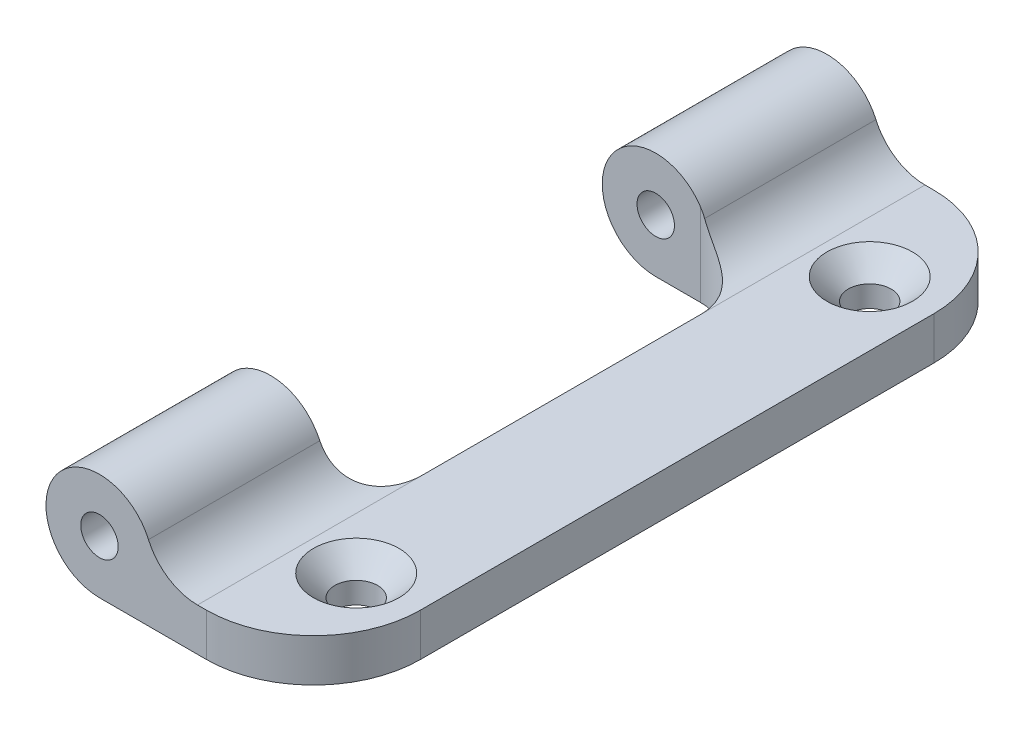
ISO-10303-21;
HEADER;
FILE_DESCRIPTION(('STEP AP214'),'2;1');
FILE_NAME('part.step','',(''),(''),'','','');
FILE_SCHEMA(('AUTOMOTIVE_DESIGN { 1 0 10303 214 1 1 1 1 }'));
ENDSEC;
DATA;
#1=APPLICATION_CONTEXT('core data for automotive mechanical design processes');
#2=APPLICATION_PROTOCOL_DEFINITION('international standard','automotive_design',2000,#1);
#3=PRODUCT_CONTEXT('',#1,'mechanical');
#4=PRODUCT('Part','Part','',(#3));
#5=PRODUCT_RELATED_PRODUCT_CATEGORY('part','',(#4));
#6=PRODUCT_DEFINITION_FORMATION('','',#4);
#7=PRODUCT_DEFINITION_CONTEXT('part definition',#1,'design');
#8=PRODUCT_DEFINITION('design','',#6,#7);
#9=PRODUCT_DEFINITION_SHAPE('','',#8);
#10=(LENGTH_UNIT() NAMED_UNIT(*) SI_UNIT(.MILLI.,.METRE.));
#11=(NAMED_UNIT(*) PLANE_ANGLE_UNIT() SI_UNIT($,.RADIAN.));
#12=(NAMED_UNIT(*) SI_UNIT($,.STERADIAN.) SOLID_ANGLE_UNIT());
#13=UNCERTAINTY_MEASURE_WITH_UNIT(LENGTH_MEASURE(1.E-05),#10,'distance_accuracy_value','');
#14=(GEOMETRIC_REPRESENTATION_CONTEXT(3) GLOBAL_UNCERTAINTY_ASSIGNED_CONTEXT((#13)) GLOBAL_UNIT_ASSIGNED_CONTEXT((#10,
#11,#12)) REPRESENTATION_CONTEXT('',''));
#15=CARTESIAN_POINT('',(0.,0.,0.));
#16=DIRECTION('',(0.,0.,1.));
#17=DIRECTION('',(1.,0.,0.));
#18=AXIS2_PLACEMENT_3D('',#15,#16,#17);
#19=CARTESIAN_POINT('',(0.,5.,68.));
#20=DIRECTION('',(0.,0.,-1.));
#21=DIRECTION('',(-1.,0.,0.));
#22=AXIS2_PLACEMENT_3D('',#19,#20,#21);
#23=CYLINDRICAL_SURFACE('',#22,5.);
#24=DIRECTION('',(0.,0.,-1.));
#25=VECTOR('',#24,1.);
#26=CARTESIAN_POINT('',(4.58257569495584,7.,68.));
#27=LINE('',#26,#25);
#28=CARTESIAN_POINT('',(4.58257569495584,7.,68.));
#29=VERTEX_POINT('',#28);
#30=CARTESIAN_POINT('',(4.58257569495584,7.,51.9825452280495));
#31=VERTEX_POINT('',#30);
#32=EDGE_CURVE('E56',#29,#31,#27,.T.);
#33=ORIENTED_EDGE('',*,*,#32,.T.);
#34=CARTESIAN_POINT('',(4.58257569495584,7.,51.9825452280495));
#35=CARTESIAN_POINT('',(4.55343787008233,7.06676547951009,51.9849846638946));
#36=CARTESIAN_POINT('',(4.52283711737159,7.13289825603199,51.9872925793378));
#37=CARTESIAN_POINT('',(4.45883324624536,7.26364555804525,51.9914708841155));
#38=CARTESIAN_POINT('',(4.42543577663286,7.32826282187345,51.9933421277951));
#39=CARTESIAN_POINT('',(4.35584613117574,7.455991357786,51.9964835877075));
#40=CARTESIAN_POINT('',(4.31965392689031,7.51910261453582,51.997753797823));
#41=CARTESIAN_POINT('',(4.24447221296438,7.64381744036863,51.999512159927));
#42=CARTESIAN_POINT('',(4.20547731381371,7.70541778162029,51.9999987606156));
#43=CARTESIAN_POINT('',(4.16515138991168,7.76613699933984,52.));
#44=B_SPLINE_CURVE_WITH_KNOTS('',3,(#34,#35,#36,#37,#38,#39,#40,#41,#42,#43),.UNSPECIFIED.,.F.,
.F.,(4,2,2,2,4),(0.,0.218646386639917,0.43686133795651,0.655078510244873,0.873727155085823),.UNSPECIFIED.);
#45=CARTESIAN_POINT('',(4.16515138991168,7.76613699933984,52.));
#46=VERTEX_POINT('',#45);
#47=EDGE_CURVE('E11',#31,#46,#44,.T.);
#48=ORIENTED_EDGE('',*,*,#47,.T.);
#49=CARTESIAN_POINT('',(0.,5.,52.));
#50=DIRECTION('',(0.,0.,-1.));
#51=DIRECTION('',(-1.,0.,0.));
#52=AXIS2_PLACEMENT_3D('',#49,#50,#51);
#53=CIRCLE('',#52,5.);
#54=CARTESIAN_POINT('',(0.,0.,52.));
#55=VERTEX_POINT('',#54);
#56=EDGE_CURVE('E291',#55,#46,#53,.T.);
#57=ORIENTED_EDGE('',*,*,#56,.F.);
#58=DIRECTION('',(0.,0.,-1.));
#59=VECTOR('',#58,1.);
#60=CARTESIAN_POINT('',(0.,0.,68.));
#61=LINE('',#60,#59);
#62=CARTESIAN_POINT('',(0.,0.,68.));
#63=VERTEX_POINT('',#62);
#64=EDGE_CURVE('E156',#63,#55,#61,.T.);
#65=ORIENTED_EDGE('',*,*,#64,.F.);
#66=CARTESIAN_POINT('',(0.,5.,68.));
#67=DIRECTION('',(0.,0.,1.));
#68=DIRECTION('',(-1.,0.,0.));
#69=AXIS2_PLACEMENT_3D('',#66,#67,#68);
#70=CIRCLE('',#69,5.);
#71=EDGE_CURVE('E309',#29,#63,#70,.T.);
#72=ORIENTED_EDGE('',*,*,#71,.F.);
#73=EDGE_LOOP('',(#33,#48,#57,#65,#72));
#74=FACE_BOUND('',#73,.T.);
#75=ADVANCED_FACE('F34',(#74),#23,.T.);
#76=CARTESIAN_POINT('',(0.,5.,16.));
#77=DIRECTION('',(0.,0.,1.));
#78=DIRECTION('',(1.,0.,0.));
#79=AXIS2_PLACEMENT_3D('',#76,#77,#78);
#80=CIRCLE('',#79,5.);
#81=CARTESIAN_POINT('',(4.16515138991167,7.76613699933985,16.));
#82=VERTEX_POINT('',#81);
#83=CARTESIAN_POINT('',(0.,0.,16.));
#84=VERTEX_POINT('',#83);
#85=EDGE_CURVE('E141',#82,#84,#80,.T.);
#86=ORIENTED_EDGE('',*,*,#85,.F.);
#87=CARTESIAN_POINT('',(4.16515138991167,7.76613699933985,16.));
#88=CARTESIAN_POINT('',(4.2054773138137,7.7054177816203,16.0000012393844));
#89=CARTESIAN_POINT('',(4.24447221296437,7.64381744036864,16.000487840073));
#90=CARTESIAN_POINT('',(4.3196539268903,7.51910261453582,16.002246202177));
#91=CARTESIAN_POINT('',(4.35584613117574,7.45599135778601,16.0035164122925));
#92=CARTESIAN_POINT('',(4.42543577663286,7.32826282187345,16.0066578722049));
#93=CARTESIAN_POINT('',(4.45883324624536,7.26364555804525,16.0085291158845));
#94=CARTESIAN_POINT('',(4.52283711737159,7.13289825603199,16.0127074206622));
#95=CARTESIAN_POINT('',(4.55343787008233,7.06676547951009,16.0150153361054));
#96=CARTESIAN_POINT('',(4.58257569495584,7.,16.0174547719506));
#97=B_SPLINE_CURVE_WITH_KNOTS('',3,(#87,#88,#89,#90,#91,#92,#93,#94,#95,#96),.UNSPECIFIED.,.F.,
.F.,(4,2,2,2,4),(0.,0.218648644840952,0.436865817129319,0.655080768445915,0.873727155085835),.UNSPECIFIED.);
#98=CARTESIAN_POINT('',(4.58257569495584,7.,16.0174547719506));
#99=VERTEX_POINT('',#98);
#100=EDGE_CURVE('E217',#82,#99,#97,.T.);
#101=ORIENTED_EDGE('',*,*,#100,.T.);
#102=CARTESIAN_POINT('',(4.58257569495584,7.,0.));
#103=VERTEX_POINT('',#102);
#104=EDGE_CURVE('E160',#99,#103,#27,.T.);
#105=ORIENTED_EDGE('',*,*,#104,.T.);
#106=CARTESIAN_POINT('',(0.,5.,0.));
#107=DIRECTION('',(0.,0.,1.));
#108=DIRECTION('',(-1.,0.,0.));
#109=AXIS2_PLACEMENT_3D('',#106,#107,#108);
#110=CIRCLE('',#109,5.);
#111=CARTESIAN_POINT('',(0.,0.,0.));
#112=VERTEX_POINT('',#111);
#113=EDGE_CURVE('E154',#103,#112,#110,.T.);
#114=ORIENTED_EDGE('',*,*,#113,.T.);
#115=EDGE_CURVE('E135',#84,#112,#61,.T.);
#116=ORIENTED_EDGE('',*,*,#115,.F.);
#117=EDGE_LOOP('',(#86,#101,#105,#114,#116));
#118=FACE_BOUND('',#117,.T.);
#119=ADVANCED_FACE('F152',(#118),#23,.T.);
#120=CARTESIAN_POINT('',(0.,0.,68.));
#121=DIRECTION('',(0.,1.,0.));
#122=DIRECTION('',(0.,0.,1.));
#123=AXIS2_PLACEMENT_3D('',#120,#121,#122);
#124=PLANE('',#123);
#125=CARTESIAN_POINT('',(14.,0.,58.));
#126=DIRECTION('',(0.,1.,0.));
#127=DIRECTION('',(1.,0.,0.));
#128=AXIS2_PLACEMENT_3D('',#125,#126,#127);
#129=CIRCLE('',#128,2.);
#130=CARTESIAN_POINT('',(16.,0.,58.));
#131=VERTEX_POINT('',#130);
#132=EDGE_CURVE('E297',#131,#131,#129,.T.);
#133=ORIENTED_EDGE('',*,*,#132,.T.);
#134=EDGE_LOOP('',(#133));
#135=FACE_BOUND('',#134,.T.);
#136=CARTESIAN_POINT('',(14.,0.,10.));
#137=DIRECTION('',(0.,1.,0.));
#138=DIRECTION('',(-1.,0.,0.));
#139=AXIS2_PLACEMENT_3D('',#136,#137,#138);
#140=CIRCLE('',#139,2.);
#141=CARTESIAN_POINT('',(12.,0.,10.));
#142=VERTEX_POINT('',#141);
#143=EDGE_CURVE('E298',#142,#142,#140,.T.);
#144=ORIENTED_EDGE('',*,*,#143,.T.);
#145=EDGE_LOOP('',(#144));
#146=FACE_BOUND('',#145,.T.);
#147=DIRECTION('',(1.,0.,0.));
#148=VECTOR('',#147,1.);
#149=CARTESIAN_POINT('',(-5.,0.,52.));
#150=LINE('',#149,#148);
#151=CARTESIAN_POINT('',(4.16515138991168,0.,52.));
#152=VERTEX_POINT('',#151);
#153=EDGE_CURVE('E285',#55,#152,#150,.T.);
#154=ORIENTED_EDGE('',*,*,#153,.T.);
#155=CARTESIAN_POINT('',(4.16515138991167,0.,47.));
#156=DIRECTION('',(0.,1.,0.));
#157=DIRECTION('',(0.,0.,1.));
#158=AXIS2_PLACEMENT_3D('',#155,#156,#157);
#159=CIRCLE('',#158,5.);
#160=CARTESIAN_POINT('',(9.16515138991168,0.,47.));
#161=VERTEX_POINT('',#160);
#162=EDGE_CURVE('E272',#152,#161,#159,.T.);
#163=ORIENTED_EDGE('',*,*,#162,.T.);
#164=DIRECTION('',(0.,0.,-1.));
#165=VECTOR('',#164,1.);
#166=CARTESIAN_POINT('',(9.16515138991167,0.,16.));
#167=LINE('',#166,#165);
#168=CARTESIAN_POINT('',(9.16515138991167,0.,21.));
#169=VERTEX_POINT('',#168);
#170=EDGE_CURVE('E142',#161,#169,#167,.T.);
#171=ORIENTED_EDGE('',*,*,#170,.T.);
#172=CARTESIAN_POINT('',(4.16515138991167,0.,21.));
#173=DIRECTION('',(0.,1.,0.));
#174=DIRECTION('',(0.,0.,1.));
#175=AXIS2_PLACEMENT_3D('',#172,#173,#174);
#176=CIRCLE('',#175,5.);
#177=CARTESIAN_POINT('',(4.16515138991167,0.,16.));
#178=VERTEX_POINT('',#177);
#179=EDGE_CURVE('E138',#169,#178,#176,.T.);
#180=ORIENTED_EDGE('',*,*,#179,.T.);
#181=DIRECTION('',(-1.,0.,0.));
#182=VECTOR('',#181,1.);
#183=CARTESIAN_POINT('',(-5.,0.,16.));
#184=LINE('',#183,#182);
#185=EDGE_CURVE('E129',#178,#84,#184,.T.);
#186=ORIENTED_EDGE('',*,*,#185,.T.);
#187=ORIENTED_EDGE('',*,*,#115,.T.);
#188=DIRECTION('',(1.,0.,0.));
#189=VECTOR('',#188,1.);
#190=CARTESIAN_POINT('',(0.,0.,0.));
#191=LINE('',#190,#189);
#192=CARTESIAN_POINT('',(10.,0.,0.));
#193=VERTEX_POINT('',#192);
#194=EDGE_CURVE('E319',#112,#193,#191,.T.);
#195=ORIENTED_EDGE('',*,*,#194,.T.);
#196=CARTESIAN_POINT('',(10.,0.,10.));
#197=DIRECTION('',(0.,1.,0.));
#198=DIRECTION('',(0.,0.,1.));
#199=AXIS2_PLACEMENT_3D('',#196,#197,#198);
#200=CIRCLE('',#199,10.);
#201=CARTESIAN_POINT('',(20.,0.,10.));
#202=VERTEX_POINT('',#201);
#203=EDGE_CURVE('E201',#193,#202,#200,.F.);
#204=ORIENTED_EDGE('',*,*,#203,.T.);
#205=DIRECTION('',(0.,0.,-1.));
#206=VECTOR('',#205,1.);
#207=CARTESIAN_POINT('',(20.,0.,68.));
#208=LINE('',#207,#206);
#209=CARTESIAN_POINT('',(20.,0.,58.));
#210=VERTEX_POINT('',#209);
#211=EDGE_CURVE('E157',#210,#202,#208,.T.);
#212=ORIENTED_EDGE('',*,*,#211,.F.);
#213=CARTESIAN_POINT('',(10.,0.,58.));
#214=DIRECTION('',(0.,1.,0.));
#215=DIRECTION('',(0.,0.,1.));
#216=AXIS2_PLACEMENT_3D('',#213,#214,#215);
#217=CIRCLE('',#216,10.);
#218=CARTESIAN_POINT('',(10.,0.,68.));
#219=VERTEX_POINT('',#218);
#220=EDGE_CURVE('E199',#210,#219,#217,.F.);
#221=ORIENTED_EDGE('',*,*,#220,.T.);
#222=DIRECTION('',(1.,0.,0.));
#223=VECTOR('',#222,1.);
#224=CARTESIAN_POINT('',(0.,0.,68.));
#225=LINE('',#224,#223);
#226=EDGE_CURVE('E311',#63,#219,#225,.T.);
#227=ORIENTED_EDGE('',*,*,#226,.F.);
#228=ORIENTED_EDGE('',*,*,#64,.T.);
#229=EDGE_LOOP('',(#154,#163,#171,#180,#186,#187,#195,#204,#212,#221,#227,#228));
#230=FACE_BOUND('',#229,.T.);
#231=ADVANCED_FACE('F132',(#135,#146,#230),#124,.F.);
#232=CARTESIAN_POINT('',(0.,5.,68.));
#233=DIRECTION('',(0.,0.,-1.));
#234=DIRECTION('',(-1.,0.,0.));
#235=AXIS2_PLACEMENT_3D('',#232,#233,#234);
#236=CYLINDRICAL_SURFACE('',#235,1.75);
#237=CARTESIAN_POINT('',(0.,5.,68.));
#238=DIRECTION('',(0.,0.,1.));
#239=DIRECTION('',(1.,0.,0.));
#240=AXIS2_PLACEMENT_3D('',#237,#238,#239);
#241=CIRCLE('',#240,1.75);
#242=CARTESIAN_POINT('',(1.75,5.,68.));
#243=VERTEX_POINT('',#242);
#244=EDGE_CURVE('E304',#243,#243,#241,.T.);
#245=ORIENTED_EDGE('',*,*,#244,.T.);
#246=EDGE_LOOP('',(#245));
#247=FACE_BOUND('',#246,.T.);
#248=CARTESIAN_POINT('',(0.,5.,52.));
#249=DIRECTION('',(0.,0.,-1.));
#250=DIRECTION('',(-1.,0.,0.));
#251=AXIS2_PLACEMENT_3D('',#248,#249,#250);
#252=CIRCLE('',#251,1.75);
#253=CARTESIAN_POINT('',(-1.75,5.,52.));
#254=VERTEX_POINT('',#253);
#255=EDGE_CURVE('E294',#254,#254,#252,.T.);
#256=ORIENTED_EDGE('',*,*,#255,.T.);
#257=EDGE_LOOP('',(#256));
#258=FACE_BOUND('',#257,.T.);
#259=ADVANCED_FACE('F363',(#247,#258),#236,.F.);
#260=CARTESIAN_POINT('',(0.,5.,0.));
#261=DIRECTION('',(0.,0.,1.));
#262=DIRECTION('',(1.,0.,0.));
#263=AXIS2_PLACEMENT_3D('',#260,#261,#262);
#264=CIRCLE('',#263,1.75);
#265=CARTESIAN_POINT('',(1.75,5.,0.));
#266=VERTEX_POINT('',#265);
#267=EDGE_CURVE('E301',#266,#266,#264,.T.);
#268=ORIENTED_EDGE('',*,*,#267,.F.);
#269=EDGE_LOOP('',(#268));
#270=FACE_BOUND('',#269,.T.);
#271=CARTESIAN_POINT('',(0.,5.,16.));
#272=DIRECTION('',(0.,0.,1.));
#273=DIRECTION('',(1.,0.,0.));
#274=AXIS2_PLACEMENT_3D('',#271,#272,#273);
#275=CIRCLE('',#274,1.75);
#276=CARTESIAN_POINT('',(1.75,5.,16.));
#277=VERTEX_POINT('',#276);
#278=EDGE_CURVE('E150',#277,#277,#275,.T.);
#279=ORIENTED_EDGE('',*,*,#278,.T.);
#280=EDGE_LOOP('',(#279));
#281=FACE_BOUND('',#280,.T.);
#282=ADVANCED_FACE('F265',(#270,#281),#236,.F.);
#283=CARTESIAN_POINT('',(9.16515138991168,9.,68.));
#284=DIRECTION('',(0.,0.,-1.));
#285=DIRECTION('',(-1.,0.,0.));
#286=AXIS2_PLACEMENT_3D('',#283,#284,#285);
#287=CYLINDRICAL_SURFACE('',#286,5.);
#288=DIRECTION('',(0.,0.,1.));
#289=VECTOR('',#288,1.);
#290=CARTESIAN_POINT('',(9.16515138991168,4.,68.));
#291=LINE('',#290,#289);
#292=CARTESIAN_POINT('',(9.16515138991168,4.,47.));
#293=VERTEX_POINT('',#292);
#294=CARTESIAN_POINT('',(9.16515138991168,4.,68.));
#295=VERTEX_POINT('',#294);
#296=EDGE_CURVE('E167',#293,#295,#291,.T.);
#297=ORIENTED_EDGE('',*,*,#296,.F.);
#298=CARTESIAN_POINT('',(9.16515138991168,4.,47.));
#299=CARTESIAN_POINT('',(9.1651658918972,4.00004291216973,47.1391891219678));
#300=CARTESIAN_POINT('',(9.15933990465102,4.00000135124393,47.2783762101968));
#301=CARTESIAN_POINT('',(9.1361112812425,4.00005938069064,47.5557803970867));
#302=CARTESIAN_POINT('',(9.11870871594793,4.00015897019908,47.6939975016803));
#303=CARTESIAN_POINT('',(9.07239094742243,4.00080995757228,47.9687366670816));
#304=CARTESIAN_POINT('',(9.04345573776334,4.00136214235143,48.1052553548917));
#305=CARTESIAN_POINT('',(8.97428224747507,4.00352388860787,48.3753895493562));
#306=CARTESIAN_POINT('',(8.93404411314793,4.00513343639931,48.5090050935638));
#307=CARTESIAN_POINT('',(8.84250283770384,4.01021061176803,48.7725297739028));
#308=CARTESIAN_POINT('',(8.79118709621414,4.01368036198071,48.9024344969861));
#309=CARTESIAN_POINT('',(8.67791710956035,4.02347180108585,49.1574064478488));
#310=CARTESIAN_POINT('',(8.61596352835944,4.02979331202506,49.2824739769462));
#311=CARTESIAN_POINT('',(8.48199244839976,4.046431128104,49.5267107181527));
#312=CARTESIAN_POINT('',(8.40998238216124,4.05674449283799,49.6458841991261));
#313=CARTESIAN_POINT('',(8.2565678535923,4.08263040150611,49.8774280638392));
#314=CARTESIAN_POINT('',(8.17516399463648,4.09820260778218,49.989798883816));
#315=CARTESIAN_POINT('',(8.00723052265268,4.1351960365157,50.2025095965443));
#316=CARTESIAN_POINT('',(7.92102368008187,4.15636604655052,50.3031475083516));
#317=CARTESIAN_POINT('',(7.74187476662123,4.20594988904206,50.4963407655043));
#318=CARTESIAN_POINT('',(7.64893284898074,4.23436355671421,50.5888962946498));
#319=CARTESIAN_POINT('',(7.45779589026154,4.29945609264278,50.7650177138712));
#320=CARTESIAN_POINT('',(7.35960755721551,4.33612459046299,50.8485946906405));
#321=CARTESIAN_POINT('',(7.1595171315916,4.41861059075699,51.006243524273));
#322=CARTESIAN_POINT('',(7.05761569027078,4.46442649508451,51.0803170377812));
#323=CARTESIAN_POINT('',(6.8659843406129,4.55886959142048,51.2091526132145));
#324=CARTESIAN_POINT('',(6.77648745477321,4.6062635210625,51.2651707724678));
#325=CARTESIAN_POINT('',(6.59739004845183,4.70847030678996,51.3697787938335));
#326=CARTESIAN_POINT('',(6.50778953433169,4.76328272918517,51.4183690898306));
#327=CARTESIAN_POINT('',(6.32977697091677,4.88029170613999,51.508252539257));
#328=CARTESIAN_POINT('',(6.24136482225649,4.94248763899554,51.5495463063388));
#329=CARTESIAN_POINT('',(6.06694263963905,5.07405619270347,51.6251732398467));
#330=CARTESIAN_POINT('',(5.98093259037973,5.14342876782502,51.6595064506226));
#331=CARTESIAN_POINT('',(5.81734586998774,5.28473525530701,51.7198950061572));
#332=CARTESIAN_POINT('',(5.73956997005876,5.35628339663899,51.7463165184839));
#333=CARTESIAN_POINT('',(5.58790867631876,5.50505747449252,51.793963185388));
#334=CARTESIAN_POINT('',(5.5140246819017,5.58228542968215,51.815186480744));
#335=CARTESIAN_POINT('',(5.37084253834902,5.74197571021623,51.8530191708167));
#336=CARTESIAN_POINT('',(5.30154548142518,5.8244392731369,51.8696274696296));
#337=CARTESIAN_POINT('',(5.16811221466802,5.99411600316516,51.8988504335124));
#338=CARTESIAN_POINT('',(5.10397707238211,6.08133014652956,51.9114642740539));
#339=CARTESIAN_POINT('',(4.95320149548255,6.30103122738686,51.9383438998735));
#340=CARTESIAN_POINT('',(4.86971868498798,6.43594744020392,51.9507171215683));
#341=CARTESIAN_POINT('',(4.75444209522451,6.64375017608637,51.9653025493613));
#342=CARTESIAN_POINT('',(4.7177156433675,6.71382827128884,51.9694990843742));
#343=CARTESIAN_POINT('',(4.64761503011396,6.85567794862207,51.9767925493873));
#344=CARTESIAN_POINT('',(4.61424010282672,6.92744913919581,51.9798897310239));
#345=CARTESIAN_POINT('',(4.58257569495584,7.,51.9825452280495));
#346=B_SPLINE_CURVE_WITH_KNOTS('',3,(#298,#299,#300,#301,#302,#303,#304,#305,#306,#307,#308,
#309,#310,#311,#312,#313,#314,#315,#316,#317,#318,#319,#320,#321,#322,#323,#324,#325,#326,#327,
#328,#329,#330,#331,#332,#333,#334,#335,#336,#337,#338,#339,#340,#341,#342,#343,#344,#345),
.UNSPECIFIED.,.F.,.F.,(4,2,2,2,2,2,2,2,2,2,2,2,2,2,2,2,2,2,2,2,2,2,2,4),(0.,0.417442602117766,
0.834882648821115,1.2530500299855,1.67121199875266,2.0898521415447,2.5084661643085,
2.92677242035373,3.34505182302539,3.74705294895522,4.14904493065603,4.55053468571607,
4.95195435765845,5.29868860111542,5.64540258299646,5.99208739165346,6.33876999130949,
6.6652196722416,6.99178594293274,7.31842969579954,7.64514082994664,8.12159201062275,
8.35920316496744,8.59675989623113),.UNSPECIFIED.);
#347=EDGE_CURVE('E49',#293,#31,#346,.T.);
#348=ORIENTED_EDGE('',*,*,#347,.T.);
#349=ORIENTED_EDGE('',*,*,#32,.F.);
#350=CARTESIAN_POINT('',(9.16515138991168,9.,68.));
#351=DIRECTION('',(0.,0.,-1.));
#352=DIRECTION('',(-1.,0.,0.));
#353=AXIS2_PLACEMENT_3D('',#350,#351,#352);
#354=CIRCLE('',#353,5.);
#355=EDGE_CURVE('E174',#295,#29,#354,.T.);
#356=ORIENTED_EDGE('',*,*,#355,.F.);
#357=EDGE_LOOP('',(#297,#348,#349,#356));
#358=FACE_BOUND('',#357,.T.);
#359=ADVANCED_FACE('F261',(#358),#287,.F.);
#360=ORIENTED_EDGE('',*,*,#104,.F.);
#361=CARTESIAN_POINT('',(4.58257569495584,7.,16.0174547719506));
#362=CARTESIAN_POINT('',(4.63217181295971,6.88632092405713,16.0216256506377));
#363=CARTESIAN_POINT('',(4.68601906898987,6.77451714141738,16.026867198246));
#364=CARTESIAN_POINT('',(4.80180722590003,6.55529982430301,16.0403517532879));
#365=CARTESIAN_POINT('',(4.86375228982447,6.44788858555952,16.0485963084746));
#366=CARTESIAN_POINT('',(4.99558333298344,6.23772378838361,16.068992116692));
#367=CARTESIAN_POINT('',(5.06550514554435,6.13499440091589,16.0811614863257));
#368=CARTESIAN_POINT('',(5.21243003086732,5.93547138621397,16.1103356690078));
#369=CARTESIAN_POINT('',(5.28943190788864,5.83867676125315,16.1273396665549));
#370=CARTESIAN_POINT('',(5.45014019483132,5.65126885188412,16.1672277592702));
#371=CARTESIAN_POINT('',(5.53387712185836,5.56068759861012,16.1901397920654));
#372=CARTESIAN_POINT('',(5.70672820439267,5.38692344317505,16.2427217069029));
#373=CARTESIAN_POINT('',(5.79584166496898,5.30373958830478,16.2723907169578));
#374=CARTESIAN_POINT('',(5.97796952602404,5.1456036069837,16.3391988782638));
#375=CARTESIAN_POINT('',(6.07097132815665,5.0706273711003,16.3763151908981));
#376=CARTESIAN_POINT('',(6.25971789022651,4.9290828144742,16.458702084229));
#377=CARTESIAN_POINT('',(6.35546232120636,4.86251349052406,16.5039716904158));
#378=CARTESIAN_POINT('',(6.53965753151518,4.743507291808,16.5986952529508));
#379=CARTESIAN_POINT('',(6.62800873424439,4.69034228116719,16.6474304528936));
#380=CARTESIAN_POINT('',(6.80446986725762,4.591210705811,16.7521159610797));
#381=CARTESIAN_POINT('',(6.89257981060696,4.54524374339684,16.8080658703919));
#382=CARTESIAN_POINT('',(7.06740966568309,4.46029342440077,16.9271517545436));
#383=CARTESIAN_POINT('',(7.15412841856578,4.42131563998828,16.990293398043));
#384=CARTESIAN_POINT('',(7.32495568569273,4.35002710587435,17.1234851858124));
#385=CARTESIAN_POINT('',(7.4090641823459,4.31771640109553,17.1935353766272));
#386=CARTESIAN_POINT('',(7.57010328967025,4.26050532204383,17.3370188317091));
#387=CARTESIAN_POINT('',(7.64718703732696,4.23534648522494,17.4101779918123));
#388=CARTESIAN_POINT('',(7.79726178099118,4.19011191131838,17.5620964767032));
#389=CARTESIAN_POINT('',(7.87025135106839,4.17003793674564,17.6408577312063));
#390=CARTESIAN_POINT('',(8.0114306886182,4.13438283980008,17.8034827840986));
#391=CARTESIAN_POINT('',(8.07962196555949,4.11880029967206,17.8873449621981));
#392=CARTESIAN_POINT('',(8.21070742333607,4.0914852732774,18.0597238141614));
#393=CARTESIAN_POINT('',(8.27359967731126,4.07975418304326,18.1482421622855));
#394=CARTESIAN_POINT('',(8.46621917114805,4.04726092557234,18.4390706827305));
#395=CARTESIAN_POINT('',(8.58484426120365,4.03272213397733,18.6495963547898));
#396=CARTESIAN_POINT('',(8.79060943083242,4.01296908414958,19.0859874944782));
#397=CARTESIAN_POINT('',(8.877726655421,4.00776158380806,19.3118639566537));
#398=CARTESIAN_POINT('',(8.98400532427596,4.00315811468696,19.6606414717162));
#399=CARTESIAN_POINT('',(9.01556408337549,4.00216546706284,19.7798754124957));
#400=CARTESIAN_POINT('',(9.06979441551251,4.0008348679408,20.0203773480973));
#401=CARTESIAN_POINT('',(9.09246574192959,4.00049693460974,20.1416453992673));
#402=CARTESIAN_POINT('',(9.12876628787079,4.00009790570349,20.3854260272962));
#403=CARTESIAN_POINT('',(9.14240247276308,4.00003659666086,20.5079375713661));
#404=CARTESIAN_POINT('',(9.16059902673891,4.00000067053398,20.7536314933966));
#405=CARTESIAN_POINT('',(9.16515948549011,4.00002605259323,20.8768138647173));
#406=CARTESIAN_POINT('',(9.16515138991167,4.,21.));
#407=B_SPLINE_CURVE_WITH_KNOTS('',3,(#361,#362,#363,#364,#365,#366,#367,#368,#369,#370,#371,
#372,#373,#374,#375,#376,#377,#378,#379,#380,#381,#382,#383,#384,#385,#386,#387,#388,#389,#390,
#391,#392,#393,#394,#395,#396,#397,#398,#399,#400,#401,#402,#403,#404,#405,#406),.UNSPECIFIED.,
.F.,.F.,(4,2,2,2,2,2,2,2,2,2,2,2,2,2,2,2,2,2,2,2,2,2,4),(0.,0.372227411604939,0.744646941680104,
1.11881074037418,1.49291146281075,1.86881473555987,2.24466952548919,2.61938883117865,
2.99406337880144,3.33576762193187,3.6774529789224,4.01940954727637,4.36136841964979,
4.6886554638795,5.01605579758478,5.34335267143917,5.67076804973285,6.39394115917533,
7.11763779241528,7.48738368792428,7.85713984291186,8.22661061292276,8.59607773256564),.UNSPECIFIED.);
#408=CARTESIAN_POINT('',(9.16515138991168,4.,21.));
#409=VERTEX_POINT('',#408);
#410=EDGE_CURVE('E223',#99,#409,#407,.T.);
#411=ORIENTED_EDGE('',*,*,#410,.T.);
#412=CARTESIAN_POINT('',(9.16515138991168,4.,0.));
#413=VERTEX_POINT('',#412);
#414=EDGE_CURVE('E168',#413,#409,#291,.T.);
#415=ORIENTED_EDGE('',*,*,#414,.F.);
#416=CARTESIAN_POINT('',(9.16515138991168,9.,0.));
#417=DIRECTION('',(0.,0.,-1.));
#418=DIRECTION('',(-1.,0.,0.));
#419=AXIS2_PLACEMENT_3D('',#416,#417,#418);
#420=CIRCLE('',#419,5.);
#421=EDGE_CURVE('E170',#103,#413,#420,.F.);
#422=ORIENTED_EDGE('',*,*,#421,.F.);
#423=EDGE_LOOP('',(#360,#411,#415,#422));
#424=FACE_BOUND('',#423,.T.);
#425=ADVANCED_FACE('F264',(#424),#287,.F.);
#426=CARTESIAN_POINT('',(0.,5.,68.));
#427=DIRECTION('',(0.,0.,-1.));
#428=DIRECTION('',(-1.,0.,0.));
#429=AXIS2_PLACEMENT_3D('',#426,#427,#428);
#430=PLANE('',#429);
#431=ORIENTED_EDGE('',*,*,#226,.T.);
#432=DIRECTION('',(0.,1.,0.));
#433=VECTOR('',#432,1.);
#434=CARTESIAN_POINT('',(10.,5.,68.));
#435=LINE('',#434,#433);
#436=CARTESIAN_POINT('',(10.,4.,68.));
#437=VERTEX_POINT('',#436);
#438=EDGE_CURVE('E203',#219,#437,#435,.T.);
#439=ORIENTED_EDGE('',*,*,#438,.T.);
#440=DIRECTION('',(-1.,0.,0.));
#441=VECTOR('',#440,1.);
#442=CARTESIAN_POINT('',(20.,4.,68.));
#443=LINE('',#442,#441);
#444=EDGE_CURVE('E315',#437,#295,#443,.T.);
#445=ORIENTED_EDGE('',*,*,#444,.T.);
#446=ORIENTED_EDGE('',*,*,#355,.T.);
#447=ORIENTED_EDGE('',*,*,#71,.T.);
#448=EDGE_LOOP('',(#431,#439,#445,#446,#447));
#449=FACE_BOUND('',#448,.T.);
#450=ORIENTED_EDGE('',*,*,#244,.F.);
#451=EDGE_LOOP('',(#450));
#452=FACE_BOUND('',#451,.T.);
#453=ADVANCED_FACE('F337',(#449,#452),#430,.F.);
#454=CARTESIAN_POINT('',(0.,5.,0.));
#455=DIRECTION('',(0.,0.,-1.));
#456=DIRECTION('',(-1.,0.,0.));
#457=AXIS2_PLACEMENT_3D('',#454,#455,#456);
#458=PLANE('',#457);
#459=DIRECTION('',(-1.,0.,0.));
#460=VECTOR('',#459,1.);
#461=CARTESIAN_POINT('',(20.,4.,0.));
#462=LINE('',#461,#460);
#463=CARTESIAN_POINT('',(10.,4.,0.));
#464=VERTEX_POINT('',#463);
#465=EDGE_CURVE('E312',#464,#413,#462,.T.);
#466=ORIENTED_EDGE('',*,*,#465,.F.);
#467=DIRECTION('',(0.,1.,0.));
#468=VECTOR('',#467,1.);
#469=CARTESIAN_POINT('',(10.,0.,0.));
#470=LINE('',#469,#468);
#471=EDGE_CURVE('E197',#464,#193,#470,.F.);
#472=ORIENTED_EDGE('',*,*,#471,.T.);
#473=ORIENTED_EDGE('',*,*,#194,.F.);
#474=ORIENTED_EDGE('',*,*,#113,.F.);
#475=ORIENTED_EDGE('',*,*,#421,.T.);
#476=EDGE_LOOP('',(#466,#472,#473,#474,#475));
#477=FACE_BOUND('',#476,.T.);
#478=ORIENTED_EDGE('',*,*,#267,.T.);
#479=EDGE_LOOP('',(#478));
#480=FACE_BOUND('',#479,.T.);
#481=ADVANCED_FACE('F374',(#477,#480),#458,.T.);
#482=CARTESIAN_POINT('',(20.,0.,68.));
#483=DIRECTION('',(-1.,0.,0.));
#484=DIRECTION('',(0.,0.,1.));
#485=AXIS2_PLACEMENT_3D('',#482,#483,#484);
#486=PLANE('',#485);
#487=ORIENTED_EDGE('',*,*,#211,.T.);
#488=DIRECTION('',(0.,1.,0.));
#489=VECTOR('',#488,1.);
#490=CARTESIAN_POINT('',(20.,4.,10.));
#491=LINE('',#490,#489);
#492=CARTESIAN_POINT('',(20.,4.,10.));
#493=VERTEX_POINT('',#492);
#494=EDGE_CURVE('E190',#202,#493,#491,.T.);
#495=ORIENTED_EDGE('',*,*,#494,.T.);
#496=DIRECTION('',(0.,0.,-1.));
#497=VECTOR('',#496,1.);
#498=CARTESIAN_POINT('',(20.,4.,68.));
#499=LINE('',#498,#497);
#500=CARTESIAN_POINT('',(20.,4.,58.));
#501=VERTEX_POINT('',#500);
#502=EDGE_CURVE('E162',#501,#493,#499,.T.);
#503=ORIENTED_EDGE('',*,*,#502,.F.);
#504=DIRECTION('',(0.,1.,0.));
#505=VECTOR('',#504,1.);
#506=CARTESIAN_POINT('',(20.,0.,58.));
#507=LINE('',#506,#505);
#508=EDGE_CURVE('E188',#501,#210,#507,.F.);
#509=ORIENTED_EDGE('',*,*,#508,.T.);
#510=EDGE_LOOP('',(#487,#495,#503,#509));
#511=FACE_BOUND('',#510,.T.);
#512=ADVANCED_FACE('F329',(#511),#486,.F.);
#513=CARTESIAN_POINT('',(20.,4.,68.));
#514=DIRECTION('',(0.,-1.,0.));
#515=DIRECTION('',(1.,0.,0.));
#516=AXIS2_PLACEMENT_3D('',#513,#514,#515);
#517=PLANE('',#516);
#518=CARTESIAN_POINT('',(14.,4.,10.));
#519=DIRECTION('',(0.,-1.,0.));
#520=DIRECTION('',(1.,0.,0.));
#521=AXIS2_PLACEMENT_3D('',#518,#519,#520);
#522=CIRCLE('',#521,4.);
#523=CARTESIAN_POINT('',(18.,4.,10.));
#524=VERTEX_POINT('',#523);
#525=EDGE_CURVE('E179',#524,#524,#522,.T.);
#526=ORIENTED_EDGE('',*,*,#525,.T.);
#527=EDGE_LOOP('',(#526));
#528=FACE_BOUND('',#527,.T.);
#529=CARTESIAN_POINT('',(14.,4.,58.));
#530=DIRECTION('',(0.,-1.,0.));
#531=DIRECTION('',(1.,0.,0.));
#532=AXIS2_PLACEMENT_3D('',#529,#530,#531);
#533=CIRCLE('',#532,4.);
#534=CARTESIAN_POINT('',(18.,4.,58.));
#535=VERTEX_POINT('',#534);
#536=EDGE_CURVE('E176',#535,#535,#533,.T.);
#537=ORIENTED_EDGE('',*,*,#536,.T.);
#538=EDGE_LOOP('',(#537));
#539=FACE_BOUND('',#538,.T.);
#540=ORIENTED_EDGE('',*,*,#502,.T.);
#541=CARTESIAN_POINT('',(10.,4.,10.));
#542=DIRECTION('',(0.,-1.,0.));
#543=DIRECTION('',(1.,0.,0.));
#544=AXIS2_PLACEMENT_3D('',#541,#542,#543);
#545=CIRCLE('',#544,10.);
#546=EDGE_CURVE('E195',#493,#464,#545,.F.);
#547=ORIENTED_EDGE('',*,*,#546,.T.);
#548=ORIENTED_EDGE('',*,*,#465,.T.);
#549=ORIENTED_EDGE('',*,*,#414,.T.);
#550=EDGE_CURVE('E171',#409,#293,#291,.T.);
#551=ORIENTED_EDGE('',*,*,#550,.T.);
#552=ORIENTED_EDGE('',*,*,#296,.T.);
#553=ORIENTED_EDGE('',*,*,#444,.F.);
#554=CARTESIAN_POINT('',(10.,4.,58.));
#555=DIRECTION('',(0.,-1.,0.));
#556=DIRECTION('',(1.,0.,0.));
#557=AXIS2_PLACEMENT_3D('',#554,#555,#556);
#558=CIRCLE('',#557,10.);
#559=EDGE_CURVE('E193',#437,#501,#558,.F.);
#560=ORIENTED_EDGE('',*,*,#559,.T.);
#561=EDGE_LOOP('',(#540,#547,#548,#549,#551,#552,#553,#560));
#562=FACE_BOUND('',#561,.T.);
#563=ADVANCED_FACE('F324',(#528,#539,#562),#517,.F.);
#564=CARTESIAN_POINT('',(14.,0.,58.));
#565=DIRECTION('',(0.,1.,0.));
#566=DIRECTION('',(-1.,0.,0.));
#567=AXIS2_PLACEMENT_3D('',#564,#565,#566);
#568=CYLINDRICAL_SURFACE('',#567,2.);
#569=CARTESIAN_POINT('',(14.,2.,58.));
#570=DIRECTION('',(0.,-1.,0.));
#571=DIRECTION('',(0.,0.,-1.));
#572=AXIS2_PLACEMENT_3D('',#569,#570,#571);
#573=CIRCLE('',#572,2.);
#574=CARTESIAN_POINT('',(14.,2.,56.));
#575=VERTEX_POINT('',#574);
#576=EDGE_CURVE('E185',#575,#575,#573,.F.);
#577=ORIENTED_EDGE('',*,*,#576,.T.);
#578=EDGE_LOOP('',(#577));
#579=FACE_BOUND('',#578,.T.);
#580=ORIENTED_EDGE('',*,*,#132,.F.);
#581=EDGE_LOOP('',(#580));
#582=FACE_BOUND('',#581,.T.);
#583=ADVANCED_FACE('F377',(#579,#582),#568,.F.);
#584=CARTESIAN_POINT('',(14.,0.,10.));
#585=DIRECTION('',(0.,1.,0.));
#586=DIRECTION('',(-1.,0.,0.));
#587=AXIS2_PLACEMENT_3D('',#584,#585,#586);
#588=CYLINDRICAL_SURFACE('',#587,2.);
#589=CARTESIAN_POINT('',(14.,2.,10.));
#590=DIRECTION('',(0.,-1.,0.));
#591=DIRECTION('',(0.,0.,-1.));
#592=AXIS2_PLACEMENT_3D('',#589,#590,#591);
#593=CIRCLE('',#592,2.);
#594=CARTESIAN_POINT('',(14.,2.,8.));
#595=VERTEX_POINT('',#594);
#596=EDGE_CURVE('E182',#595,#595,#593,.F.);
#597=ORIENTED_EDGE('',*,*,#596,.T.);
#598=EDGE_LOOP('',(#597));
#599=FACE_BOUND('',#598,.T.);
#600=ORIENTED_EDGE('',*,*,#143,.F.);
#601=EDGE_LOOP('',(#600));
#602=FACE_BOUND('',#601,.T.);
#603=ADVANCED_FACE('F259',(#599,#602),#588,.F.);
#604=CARTESIAN_POINT('',(14.,4.,10.));
#605=DIRECTION('',(0.,1.,0.));
#606=DIRECTION('',(0.,0.,1.));
#607=AXIS2_PLACEMENT_3D('',#604,#605,#606);
#608=CONICAL_SURFACE('',#607,4.,0.785398163397448);
#609=ORIENTED_EDGE('',*,*,#596,.F.);
#610=EDGE_LOOP('',(#609));
#611=FACE_BOUND('',#610,.T.);
#612=ORIENTED_EDGE('',*,*,#525,.F.);
#613=EDGE_LOOP('',(#612));
#614=FACE_BOUND('',#613,.T.);
#615=ADVANCED_FACE('F254',(#611,#614),#608,.F.);
#616=CARTESIAN_POINT('',(14.,4.,58.));
#617=DIRECTION('',(0.,1.,0.));
#618=DIRECTION('',(0.,0.,1.));
#619=AXIS2_PLACEMENT_3D('',#616,#617,#618);
#620=CONICAL_SURFACE('',#619,4.,0.785398163397448);
#621=ORIENTED_EDGE('',*,*,#576,.F.);
#622=EDGE_LOOP('',(#621));
#623=FACE_BOUND('',#622,.T.);
#624=ORIENTED_EDGE('',*,*,#536,.F.);
#625=EDGE_LOOP('',(#624));
#626=FACE_BOUND('',#625,.T.);
#627=ADVANCED_FACE('F246',(#623,#626),#620,.F.);
#628=CARTESIAN_POINT('',(10.,0.,10.));
#629=DIRECTION('',(0.,-1.,0.));
#630=DIRECTION('',(0.,0.,-1.));
#631=AXIS2_PLACEMENT_3D('',#628,#629,#630);
#632=CYLINDRICAL_SURFACE('',#631,10.);
#633=ORIENTED_EDGE('',*,*,#203,.F.);
#634=ORIENTED_EDGE('',*,*,#471,.F.);
#635=ORIENTED_EDGE('',*,*,#546,.F.);
#636=ORIENTED_EDGE('',*,*,#494,.F.);
#637=EDGE_LOOP('',(#633,#634,#635,#636));
#638=FACE_BOUND('',#637,.T.);
#639=ADVANCED_FACE('F242',(#638),#632,.T.);
#640=CARTESIAN_POINT('',(10.,5.,58.));
#641=DIRECTION('',(0.,1.,0.));
#642=DIRECTION('',(0.,0.,1.));
#643=AXIS2_PLACEMENT_3D('',#640,#641,#642);
#644=CYLINDRICAL_SURFACE('',#643,10.);
#645=ORIENTED_EDGE('',*,*,#220,.F.);
#646=ORIENTED_EDGE('',*,*,#508,.F.);
#647=ORIENTED_EDGE('',*,*,#559,.F.);
#648=ORIENTED_EDGE('',*,*,#438,.F.);
#649=EDGE_LOOP('',(#645,#646,#647,#648));
#650=FACE_BOUND('',#649,.T.);
#651=ADVANCED_FACE('F237',(#650),#644,.T.);
#652=CARTESIAN_POINT('',(-5.,10.,52.));
#653=DIRECTION('',(0.,0.,-1.));
#654=DIRECTION('',(-1.,0.,0.));
#655=AXIS2_PLACEMENT_3D('',#652,#653,#654);
#656=PLANE('',#655);
#657=ORIENTED_EDGE('',*,*,#255,.F.);
#658=EDGE_LOOP('',(#657));
#659=FACE_BOUND('',#658,.T.);
#660=ORIENTED_EDGE('',*,*,#56,.T.);
#661=DIRECTION('',(0.,-1.,0.));
#662=VECTOR('',#661,1.);
#663=CARTESIAN_POINT('',(4.16515138991168,0.,52.));
#664=LINE('',#663,#662);
#665=EDGE_CURVE('E213',#46,#152,#664,.T.);
#666=ORIENTED_EDGE('',*,*,#665,.T.);
#667=ORIENTED_EDGE('',*,*,#153,.F.);
#668=EDGE_LOOP('',(#660,#666,#667));
#669=FACE_BOUND('',#668,.T.);
#670=ADVANCED_FACE('F241',(#659,#669),#656,.T.);
#671=CARTESIAN_POINT('',(9.16515138991167,10.,16.));
#672=DIRECTION('',(-1.,0.,0.));
#673=DIRECTION('',(0.,-1.,0.));
#674=AXIS2_PLACEMENT_3D('',#671,#672,#673);
#675=PLANE('',#674);
#676=ORIENTED_EDGE('',*,*,#550,.F.);
#677=DIRECTION('',(0.,-1.,0.));
#678=VECTOR('',#677,1.);
#679=CARTESIAN_POINT('',(9.16515138991167,0.,21.));
#680=LINE('',#679,#678);
#681=EDGE_CURVE('E209',#409,#169,#680,.T.);
#682=ORIENTED_EDGE('',*,*,#681,.T.);
#683=ORIENTED_EDGE('',*,*,#170,.F.);
#684=DIRECTION('',(0.,-1.,0.));
#685=VECTOR('',#684,1.);
#686=CARTESIAN_POINT('',(9.16515138991167,4.,47.));
#687=LINE('',#686,#685);
#688=EDGE_CURVE('E206',#161,#293,#687,.F.);
#689=ORIENTED_EDGE('',*,*,#688,.T.);
#690=EDGE_LOOP('',(#676,#682,#683,#689));
#691=FACE_BOUND('',#690,.T.);
#692=ADVANCED_FACE('F282',(#691),#675,.T.);
#693=CARTESIAN_POINT('',(-5.00000000000001,10.,16.));
#694=DIRECTION('',(0.,0.,1.));
#695=DIRECTION('',(1.,0.,0.));
#696=AXIS2_PLACEMENT_3D('',#693,#694,#695);
#697=PLANE('',#696);
#698=ORIENTED_EDGE('',*,*,#278,.F.);
#699=EDGE_LOOP('',(#698));
#700=FACE_BOUND('',#699,.T.);
#701=ORIENTED_EDGE('',*,*,#185,.F.);
#702=DIRECTION('',(0.,-1.,0.));
#703=VECTOR('',#702,1.);
#704=CARTESIAN_POINT('',(4.16515138991167,4.,16.));
#705=LINE('',#704,#703);
#706=EDGE_CURVE('E146',#178,#82,#705,.F.);
#707=ORIENTED_EDGE('',*,*,#706,.T.);
#708=ORIENTED_EDGE('',*,*,#85,.T.);
#709=EDGE_LOOP('',(#701,#707,#708));
#710=FACE_BOUND('',#709,.T.);
#711=ADVANCED_FACE('F145',(#700,#710),#697,.T.);
#712=CARTESIAN_POINT('',(4.16515138991167,10.,21.));
#713=DIRECTION('',(0.,1.,0.));
#714=DIRECTION('',(-1.,0.,0.));
#715=AXIS2_PLACEMENT_3D('',#712,#713,#714);
#716=CYLINDRICAL_SURFACE('',#715,5.);
#717=ORIENTED_EDGE('',*,*,#100,.F.);
#718=ORIENTED_EDGE('',*,*,#706,.F.);
#719=ORIENTED_EDGE('',*,*,#179,.F.);
#720=ORIENTED_EDGE('',*,*,#681,.F.);
#721=ORIENTED_EDGE('',*,*,#410,.F.);
#722=EDGE_LOOP('',(#717,#718,#719,#720,#721));
#723=FACE_BOUND('',#722,.T.);
#724=ADVANCED_FACE('F232',(#723),#716,.F.);
#725=CARTESIAN_POINT('',(4.16515138991167,10.,47.));
#726=DIRECTION('',(0.,1.,0.));
#727=DIRECTION('',(-1.,0.,0.));
#728=AXIS2_PLACEMENT_3D('',#725,#726,#727);
#729=CYLINDRICAL_SURFACE('',#728,5.);
#730=ORIENTED_EDGE('',*,*,#347,.F.);
#731=ORIENTED_EDGE('',*,*,#688,.F.);
#732=ORIENTED_EDGE('',*,*,#162,.F.);
#733=ORIENTED_EDGE('',*,*,#665,.F.);
#734=ORIENTED_EDGE('',*,*,#47,.F.);
#735=EDGE_LOOP('',(#730,#731,#732,#733,#734));
#736=FACE_BOUND('',#735,.T.);
#737=ADVANCED_FACE('F36',(#736),#729,.F.);
#738=CLOSED_SHELL('',(#75,#119,#231,#259,#282,#359,#425,#453,#481,#512,#563,#583,#603,#615,#627,
#639,#651,#670,#692,#711,#724,#737));
#739=MANIFOLD_SOLID_BREP('B2',#738);
#740=ADVANCED_BREP_SHAPE_REPRESENTATION('',(#18,#739),#14);
#741=SHAPE_DEFINITION_REPRESENTATION(#9,#740);
ENDSEC;
END-ISO-10303-21;
